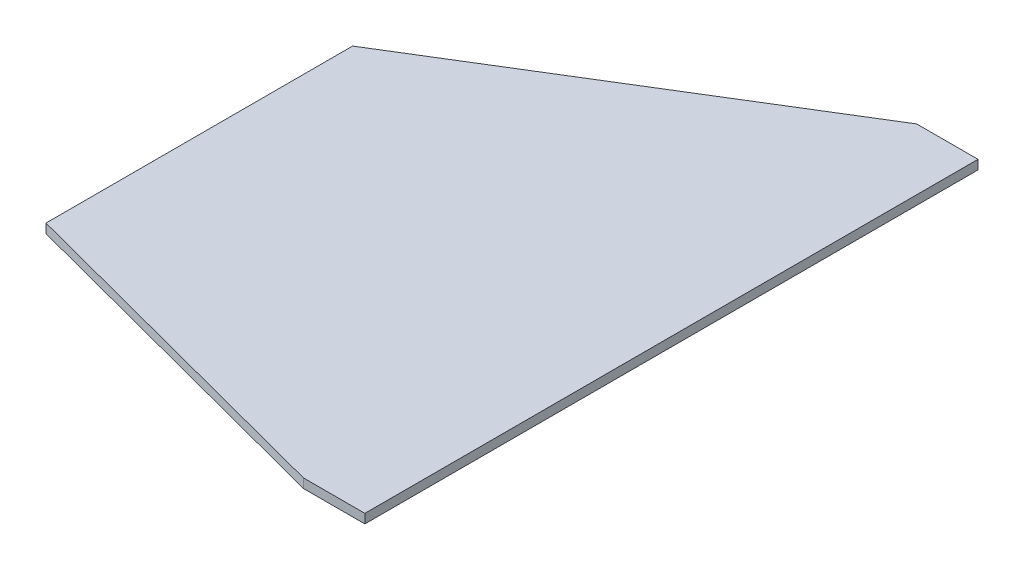
ISO-10303-21;
HEADER;
FILE_DESCRIPTION(('STEP AP214'),'2;1');
FILE_NAME('part.step','',(''),(''),'','','');
FILE_SCHEMA(('AUTOMOTIVE_DESIGN { 1 0 10303 214 1 1 1 1 }'));
ENDSEC;
DATA;
#1=APPLICATION_CONTEXT('core data for automotive mechanical design processes');
#2=APPLICATION_PROTOCOL_DEFINITION('international standard','automotive_design',2000,#1);
#3=PRODUCT_CONTEXT('',#1,'mechanical');
#4=PRODUCT('Part','Part','',(#3));
#5=PRODUCT_RELATED_PRODUCT_CATEGORY('part','',(#4));
#6=PRODUCT_DEFINITION_FORMATION('','',#4);
#7=PRODUCT_DEFINITION_CONTEXT('part definition',#1,'design');
#8=PRODUCT_DEFINITION('design','',#6,#7);
#9=PRODUCT_DEFINITION_SHAPE('','',#8);
#10=(LENGTH_UNIT() NAMED_UNIT(*) SI_UNIT(.MILLI.,.METRE.));
#11=(NAMED_UNIT(*) PLANE_ANGLE_UNIT() SI_UNIT($,.RADIAN.));
#12=(NAMED_UNIT(*) SI_UNIT($,.STERADIAN.) SOLID_ANGLE_UNIT());
#13=UNCERTAINTY_MEASURE_WITH_UNIT(LENGTH_MEASURE(1.E-05),#10,'distance_accuracy_value','');
#14=(GEOMETRIC_REPRESENTATION_CONTEXT(3) GLOBAL_UNCERTAINTY_ASSIGNED_CONTEXT((#13)) GLOBAL_UNIT_ASSIGNED_CONTEXT((#10,
#11,#12)) REPRESENTATION_CONTEXT('',''));
#15=CARTESIAN_POINT('',(0.,0.,0.));
#16=DIRECTION('',(0.,0.,1.));
#17=DIRECTION('',(1.,0.,0.));
#18=AXIS2_PLACEMENT_3D('',#15,#16,#17);
#19=CARTESIAN_POINT('',(-57.,1.5,0.));
#20=DIRECTION('',(1.,0.,0.));
#21=DIRECTION('',(0.,0.,-1.));
#22=AXIS2_PLACEMENT_3D('',#19,#20,#21);
#23=PLANE('',#22);
#24=DIRECTION('',(0.,0.,1.));
#25=VECTOR('',#24,1.);
#26=CARTESIAN_POINT('',(-57.,0.,0.));
#27=LINE('',#26,#25);
#28=CARTESIAN_POINT('',(-57.,0.,-65.));
#29=VERTEX_POINT('',#28);
#30=CARTESIAN_POINT('',(-57.,0.,-15.));
#31=VERTEX_POINT('',#30);
#32=EDGE_CURVE('E123',#29,#31,#27,.T.);
#33=ORIENTED_EDGE('',*,*,#32,.T.);
#34=DIRECTION('',(0.,-1.,0.));
#35=VECTOR('',#34,1.);
#36=CARTESIAN_POINT('',(-57.,1.5,-15.));
#37=LINE('',#36,#35);
#38=CARTESIAN_POINT('',(-57.,1.5,-15.));
#39=VERTEX_POINT('',#38);
#40=EDGE_CURVE('E11',#39,#31,#37,.T.);
#41=ORIENTED_EDGE('',*,*,#40,.F.);
#42=DIRECTION('',(0.,0.,1.));
#43=VECTOR('',#42,1.);
#44=CARTESIAN_POINT('',(-57.,1.5,0.));
#45=LINE('',#44,#43);
#46=CARTESIAN_POINT('',(-57.,1.5,-65.));
#47=VERTEX_POINT('',#46);
#48=EDGE_CURVE('E136',#47,#39,#45,.T.);
#49=ORIENTED_EDGE('',*,*,#48,.F.);
#50=DIRECTION('',(0.,-1.,0.));
#51=VECTOR('',#50,1.);
#52=CARTESIAN_POINT('',(-57.,1.5,-65.));
#53=LINE('',#52,#51);
#54=EDGE_CURVE('E119',#47,#29,#53,.T.);
#55=ORIENTED_EDGE('',*,*,#54,.T.);
#56=EDGE_LOOP('',(#33,#41,#49,#55));
#57=FACE_BOUND('',#56,.T.);
#58=ADVANCED_FACE('F41',(#57),#23,.F.);
#59=CARTESIAN_POINT('',(0.,1.5,0.));
#60=DIRECTION('',(0.254493299279644,0.,-0.967074537262646));
#61=DIRECTION('',(-0.967074537262646,0.,-0.254493299279644));
#62=AXIS2_PLACEMENT_3D('',#59,#60,#61);
#63=PLANE('',#62);
#64=DIRECTION('',(0.967074537262646,0.,0.254493299279644));
#65=VECTOR('',#64,1.);
#66=CARTESIAN_POINT('',(0.,0.,0.));
#67=LINE('',#66,#65);
#68=CARTESIAN_POINT('',(0.,0.,0.));
#69=VERTEX_POINT('',#68);
#70=EDGE_CURVE('E126',#31,#69,#67,.T.);
#71=ORIENTED_EDGE('',*,*,#70,.T.);
#72=DIRECTION('',(0.,-1.,0.));
#73=VECTOR('',#72,1.);
#74=CARTESIAN_POINT('',(0.,1.5,0.));
#75=LINE('',#74,#73);
#76=CARTESIAN_POINT('',(0.,1.5,0.));
#77=VERTEX_POINT('',#76);
#78=EDGE_CURVE('E49',#77,#69,#75,.T.);
#79=ORIENTED_EDGE('',*,*,#78,.F.);
#80=DIRECTION('',(0.967074537262646,0.,0.254493299279644));
#81=VECTOR('',#80,1.);
#82=CARTESIAN_POINT('',(0.,1.5,0.));
#83=LINE('',#82,#81);
#84=EDGE_CURVE('E90',#39,#77,#83,.T.);
#85=ORIENTED_EDGE('',*,*,#84,.F.);
#86=ORIENTED_EDGE('',*,*,#40,.T.);
#87=EDGE_LOOP('',(#71,#79,#85,#86));
#88=FACE_BOUND('',#87,.T.);
#89=ADVANCED_FACE('F142',(#88),#63,.F.);
#90=CARTESIAN_POINT('',(0.,1.5,0.));
#91=DIRECTION('',(0.,0.,1.));
#92=DIRECTION('',(1.,0.,0.));
#93=AXIS2_PLACEMENT_3D('',#90,#91,#92);
#94=PLANE('',#93);
#95=DIRECTION('',(-1.,0.,0.));
#96=VECTOR('',#95,1.);
#97=CARTESIAN_POINT('',(0.,0.,0.));
#98=LINE('',#97,#96);
#99=CARTESIAN_POINT('',(10.,0.,0.));
#100=VERTEX_POINT('',#99);
#101=EDGE_CURVE('E129',#100,#69,#98,.T.);
#102=ORIENTED_EDGE('',*,*,#101,.F.);
#103=DIRECTION('',(0.,-1.,0.));
#104=VECTOR('',#103,1.);
#105=CARTESIAN_POINT('',(10.,1.5,0.));
#106=LINE('',#105,#104);
#107=CARTESIAN_POINT('',(10.,1.5,0.));
#108=VERTEX_POINT('',#107);
#109=EDGE_CURVE('E109',#108,#100,#106,.T.);
#110=ORIENTED_EDGE('',*,*,#109,.F.);
#111=DIRECTION('',(-1.,0.,0.));
#112=VECTOR('',#111,1.);
#113=CARTESIAN_POINT('',(0.,1.5,0.));
#114=LINE('',#113,#112);
#115=EDGE_CURVE('E115',#108,#77,#114,.T.);
#116=ORIENTED_EDGE('',*,*,#115,.T.);
#117=ORIENTED_EDGE('',*,*,#78,.T.);
#118=EDGE_LOOP('',(#102,#110,#116,#117));
#119=FACE_BOUND('',#118,.T.);
#120=ADVANCED_FACE('F141',(#119),#94,.T.);
#121=CARTESIAN_POINT('',(10.,1.5,0.));
#122=DIRECTION('',(1.,0.,0.));
#123=DIRECTION('',(0.,0.,-1.));
#124=AXIS2_PLACEMENT_3D('',#121,#122,#123);
#125=PLANE('',#124);
#126=DIRECTION('',(0.,0.,1.));
#127=VECTOR('',#126,1.);
#128=CARTESIAN_POINT('',(10.,0.,0.));
#129=LINE('',#128,#127);
#130=CARTESIAN_POINT('',(10.,0.,-100.));
#131=VERTEX_POINT('',#130);
#132=EDGE_CURVE('E104',#131,#100,#129,.T.);
#133=ORIENTED_EDGE('',*,*,#132,.F.);
#134=DIRECTION('',(0.,-1.,0.));
#135=VECTOR('',#134,1.);
#136=CARTESIAN_POINT('',(10.,1.5,-100.));
#137=LINE('',#136,#135);
#138=CARTESIAN_POINT('',(10.,1.5,-100.));
#139=VERTEX_POINT('',#138);
#140=EDGE_CURVE('E99',#139,#131,#137,.T.);
#141=ORIENTED_EDGE('',*,*,#140,.F.);
#142=DIRECTION('',(0.,0.,1.));
#143=VECTOR('',#142,1.);
#144=CARTESIAN_POINT('',(10.,1.5,0.));
#145=LINE('',#144,#143);
#146=EDGE_CURVE('E102',#139,#108,#145,.T.);
#147=ORIENTED_EDGE('',*,*,#146,.T.);
#148=ORIENTED_EDGE('',*,*,#109,.T.);
#149=EDGE_LOOP('',(#133,#141,#147,#148));
#150=FACE_BOUND('',#149,.T.);
#151=ADVANCED_FACE('F101',(#150),#125,.T.);
#152=CARTESIAN_POINT('',(0.,1.5,-100.));
#153=DIRECTION('',(0.,0.,-1.));
#154=DIRECTION('',(-1.,0.,0.));
#155=AXIS2_PLACEMENT_3D('',#152,#153,#154);
#156=PLANE('',#155);
#157=DIRECTION('',(1.,0.,0.));
#158=VECTOR('',#157,1.);
#159=CARTESIAN_POINT('',(0.,0.,-100.));
#160=LINE('',#159,#158);
#161=CARTESIAN_POINT('',(0.,0.,-100.));
#162=VERTEX_POINT('',#161);
#163=EDGE_CURVE('E133',#162,#131,#160,.T.);
#164=ORIENTED_EDGE('',*,*,#163,.F.);
#165=DIRECTION('',(0.,-1.,0.));
#166=VECTOR('',#165,1.);
#167=CARTESIAN_POINT('',(0.,1.5,-100.));
#168=LINE('',#167,#166);
#169=CARTESIAN_POINT('',(0.,1.5,-100.));
#170=VERTEX_POINT('',#169);
#171=EDGE_CURVE('E79',#170,#162,#168,.T.);
#172=ORIENTED_EDGE('',*,*,#171,.F.);
#173=DIRECTION('',(1.,0.,0.));
#174=VECTOR('',#173,1.);
#175=CARTESIAN_POINT('',(0.,1.5,-100.));
#176=LINE('',#175,#174);
#177=EDGE_CURVE('E113',#170,#139,#176,.T.);
#178=ORIENTED_EDGE('',*,*,#177,.T.);
#179=ORIENTED_EDGE('',*,*,#140,.T.);
#180=EDGE_LOOP('',(#164,#172,#178,#179));
#181=FACE_BOUND('',#180,.T.);
#182=ADVANCED_FACE('F117',(#181),#156,.T.);
#183=CARTESIAN_POINT('',(-44.590970049173,1.5,-72.6195797943675));
#184=DIRECTION('',(0.523263033336319,0.,0.852171225719148));
#185=DIRECTION('',(0.852171225719148,0.,-0.523263033336319));
#186=AXIS2_PLACEMENT_3D('',#183,#184,#185);
#187=PLANE('',#186);
#188=DIRECTION('',(-0.852171225719148,0.,0.523263033336319));
#189=VECTOR('',#188,1.);
#190=CARTESIAN_POINT('',(-44.590970049173,0.,-72.6195797943675));
#191=LINE('',#190,#189);
#192=EDGE_CURVE('E82',#162,#29,#191,.T.);
#193=ORIENTED_EDGE('',*,*,#192,.T.);
#194=ORIENTED_EDGE('',*,*,#54,.F.);
#195=DIRECTION('',(-0.852171225719148,0.,0.523263033336319));
#196=VECTOR('',#195,1.);
#197=CARTESIAN_POINT('',(-44.590970049173,1.5,-72.6195797943675));
#198=LINE('',#197,#196);
#199=EDGE_CURVE('E57',#170,#47,#198,.T.);
#200=ORIENTED_EDGE('',*,*,#199,.F.);
#201=ORIENTED_EDGE('',*,*,#171,.T.);
#202=EDGE_LOOP('',(#193,#194,#200,#201));
#203=FACE_BOUND('',#202,.T.);
#204=ADVANCED_FACE('F149',(#203),#187,.F.);
#205=CARTESIAN_POINT('',(0.,1.5,0.));
#206=DIRECTION('',(0.,1.,0.));
#207=DIRECTION('',(0.,0.,1.));
#208=AXIS2_PLACEMENT_3D('',#205,#206,#207);
#209=PLANE('',#208);
#210=ORIENTED_EDGE('',*,*,#48,.T.);
#211=ORIENTED_EDGE('',*,*,#84,.T.);
#212=ORIENTED_EDGE('',*,*,#115,.F.);
#213=ORIENTED_EDGE('',*,*,#146,.F.);
#214=ORIENTED_EDGE('',*,*,#177,.F.);
#215=ORIENTED_EDGE('',*,*,#199,.T.);
#216=EDGE_LOOP('',(#210,#211,#212,#213,#214,#215));
#217=FACE_BOUND('',#216,.T.);
#218=ADVANCED_FACE('F112',(#217),#209,.T.);
#219=CARTESIAN_POINT('',(0.,0.,0.));
#220=DIRECTION('',(0.,1.,0.));
#221=DIRECTION('',(0.,0.,1.));
#222=AXIS2_PLACEMENT_3D('',#219,#220,#221);
#223=PLANE('',#222);
#224=ORIENTED_EDGE('',*,*,#32,.F.);
#225=ORIENTED_EDGE('',*,*,#192,.F.);
#226=ORIENTED_EDGE('',*,*,#163,.T.);
#227=ORIENTED_EDGE('',*,*,#132,.T.);
#228=ORIENTED_EDGE('',*,*,#101,.T.);
#229=ORIENTED_EDGE('',*,*,#70,.F.);
#230=EDGE_LOOP('',(#224,#225,#226,#227,#228,#229));
#231=FACE_BOUND('',#230,.T.);
#232=ADVANCED_FACE('F146',(#231),#223,.F.);
#233=CLOSED_SHELL('',(#58,#89,#120,#151,#182,#204,#218,#232));
#234=MANIFOLD_SOLID_BREP('B2',#233);
#235=ADVANCED_BREP_SHAPE_REPRESENTATION('',(#18,#234),#14);
#236=SHAPE_DEFINITION_REPRESENTATION(#9,#235);
ENDSEC;
END-ISO-10303-21;
